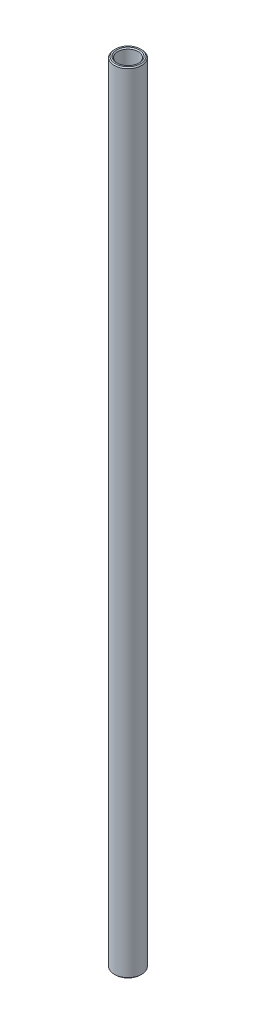
ISO-10303-21;
HEADER;
FILE_DESCRIPTION(('STEP AP214'),'2;1');
FILE_NAME('part.step','',(''),(''),'','','');
FILE_SCHEMA(('AUTOMOTIVE_DESIGN { 1 0 10303 214 1 1 1 1 }'));
ENDSEC;
DATA;
#1=APPLICATION_CONTEXT('core data for automotive mechanical design processes');
#2=APPLICATION_PROTOCOL_DEFINITION('international standard','automotive_design',2000,#1);
#3=PRODUCT_CONTEXT('',#1,'mechanical');
#4=PRODUCT('Part','Part','',(#3));
#5=PRODUCT_RELATED_PRODUCT_CATEGORY('part','',(#4));
#6=PRODUCT_DEFINITION_FORMATION('','',#4);
#7=PRODUCT_DEFINITION_CONTEXT('part definition',#1,'design');
#8=PRODUCT_DEFINITION('design','',#6,#7);
#9=PRODUCT_DEFINITION_SHAPE('','',#8);
#10=(LENGTH_UNIT() NAMED_UNIT(*) SI_UNIT(.MILLI.,.METRE.));
#11=(NAMED_UNIT(*) PLANE_ANGLE_UNIT() SI_UNIT($,.RADIAN.));
#12=(NAMED_UNIT(*) SI_UNIT($,.STERADIAN.) SOLID_ANGLE_UNIT());
#13=UNCERTAINTY_MEASURE_WITH_UNIT(LENGTH_MEASURE(1.E-05),#10,'distance_accuracy_value','');
#14=(GEOMETRIC_REPRESENTATION_CONTEXT(3) GLOBAL_UNCERTAINTY_ASSIGNED_CONTEXT((#13)) GLOBAL_UNIT_ASSIGNED_CONTEXT((#10,
#11,#12)) REPRESENTATION_CONTEXT('',''));
#15=CARTESIAN_POINT('',(0.,0.,0.));
#16=DIRECTION('',(0.,0.,1.));
#17=DIRECTION('',(1.,0.,0.));
#18=AXIS2_PLACEMENT_3D('',#15,#16,#17);
#19=CARTESIAN_POINT('',(0.,230.,0.));
#20=DIRECTION('',(0.,1.,0.));
#21=DIRECTION('',(0.,0.,1.));
#22=AXIS2_PLACEMENT_3D('',#19,#20,#21);
#23=PLANE('',#22);
#24=CARTESIAN_POINT('',(0.,230.,0.));
#25=DIRECTION('',(0.,1.,0.));
#26=DIRECTION('',(0.,0.,1.));
#27=AXIS2_PLACEMENT_3D('',#24,#25,#26);
#28=CIRCLE('',#27,3.29999999999997);
#29=CARTESIAN_POINT('',(0.,230.,3.29999999999997));
#30=VERTEX_POINT('',#29);
#31=EDGE_CURVE('E59',#30,#30,#28,.F.);
#32=ORIENTED_EDGE('',*,*,#31,.T.);
#33=EDGE_LOOP('',(#32));
#34=FACE_BOUND('',#33,.T.);
#35=CARTESIAN_POINT('',(0.,230.,0.));
#36=DIRECTION('',(0.,1.,0.));
#37=DIRECTION('',(0.,0.,1.));
#38=AXIS2_PLACEMENT_3D('',#35,#36,#37);
#39=CIRCLE('',#38,3.70000000000001);
#40=CARTESIAN_POINT('',(0.,230.,3.70000000000001));
#41=VERTEX_POINT('',#40);
#42=EDGE_CURVE('E62',#41,#41,#39,.T.);
#43=ORIENTED_EDGE('',*,*,#42,.T.);
#44=EDGE_LOOP('',(#43));
#45=FACE_BOUND('',#44,.T.);
#46=ADVANCED_FACE('F38',(#34,#45),#23,.T.);
#47=CARTESIAN_POINT('',(0.,0.,0.));
#48=DIRECTION('',(0.,1.,0.));
#49=DIRECTION('',(0.,0.,1.));
#50=AXIS2_PLACEMENT_3D('',#47,#48,#49);
#51=PLANE('',#50);
#52=CARTESIAN_POINT('',(0.,0.,0.));
#53=DIRECTION('',(0.,1.,0.));
#54=DIRECTION('',(0.,0.,1.));
#55=AXIS2_PLACEMENT_3D('',#52,#53,#54);
#56=CIRCLE('',#55,3.30000000000003);
#57=CARTESIAN_POINT('',(0.,0.,3.30000000000003));
#58=VERTEX_POINT('',#57);
#59=EDGE_CURVE('E50',#58,#58,#56,.T.);
#60=ORIENTED_EDGE('',*,*,#59,.T.);
#61=EDGE_LOOP('',(#60));
#62=FACE_BOUND('',#61,.T.);
#63=CARTESIAN_POINT('',(0.,0.,0.));
#64=DIRECTION('',(0.,1.,0.));
#65=DIRECTION('',(0.,0.,1.));
#66=AXIS2_PLACEMENT_3D('',#63,#64,#65);
#67=CIRCLE('',#66,3.70000000000001);
#68=CARTESIAN_POINT('',(0.,0.,3.70000000000001));
#69=VERTEX_POINT('',#68);
#70=EDGE_CURVE('E54',#69,#69,#67,.F.);
#71=ORIENTED_EDGE('',*,*,#70,.T.);
#72=EDGE_LOOP('',(#71));
#73=FACE_BOUND('',#72,.T.);
#74=ADVANCED_FACE('F82',(#62,#73),#51,.F.);
#75=CARTESIAN_POINT('',(0.,230.,0.));
#76=DIRECTION('',(0.,-1.,0.));
#77=DIRECTION('',(0.,0.,-1.));
#78=AXIS2_PLACEMENT_3D('',#75,#76,#77);
#79=CYLINDRICAL_SURFACE('',#78,4.);
#80=CARTESIAN_POINT('',(0.,0.299999999999967,0.));
#81=DIRECTION('',(0.,1.,0.));
#82=DIRECTION('',(0.,0.,1.));
#83=AXIS2_PLACEMENT_3D('',#80,#81,#82);
#84=CIRCLE('',#83,4.);
#85=CARTESIAN_POINT('',(0.,0.299999999999967,4.));
#86=VERTEX_POINT('',#85);
#87=EDGE_CURVE('E10',#86,#86,#84,.T.);
#88=ORIENTED_EDGE('',*,*,#87,.T.);
#89=EDGE_LOOP('',(#88));
#90=FACE_BOUND('',#89,.T.);
#91=CARTESIAN_POINT('',(0.,229.7,0.));
#92=DIRECTION('',(0.,1.,0.));
#93=DIRECTION('',(0.,0.,1.));
#94=AXIS2_PLACEMENT_3D('',#91,#92,#93);
#95=CIRCLE('',#94,4.);
#96=CARTESIAN_POINT('',(0.,229.7,4.));
#97=VERTEX_POINT('',#96);
#98=EDGE_CURVE('E46',#97,#97,#95,.F.);
#99=ORIENTED_EDGE('',*,*,#98,.T.);
#100=EDGE_LOOP('',(#99));
#101=FACE_BOUND('',#100,.T.);
#102=ADVANCED_FACE('F85',(#90,#101),#79,.T.);
#103=CARTESIAN_POINT('',(0.,230.,0.));
#104=DIRECTION('',(0.,-1.,0.));
#105=DIRECTION('',(0.,0.,-1.));
#106=AXIS2_PLACEMENT_3D('',#103,#104,#105);
#107=CYLINDRICAL_SURFACE('',#106,3.);
#108=CARTESIAN_POINT('',(0.,229.7,0.));
#109=DIRECTION('',(0.,1.,0.));
#110=DIRECTION('',(0.,0.,1.));
#111=AXIS2_PLACEMENT_3D('',#108,#109,#110);
#112=CIRCLE('',#111,3.);
#113=CARTESIAN_POINT('',(0.,229.7,3.));
#114=VERTEX_POINT('',#113);
#115=EDGE_CURVE('E65',#114,#114,#112,.T.);
#116=ORIENTED_EDGE('',*,*,#115,.T.);
#117=EDGE_LOOP('',(#116));
#118=FACE_BOUND('',#117,.T.);
#119=CARTESIAN_POINT('',(0.,0.300000000000022,0.));
#120=DIRECTION('',(0.,1.,0.));
#121=DIRECTION('',(0.,0.,1.));
#122=AXIS2_PLACEMENT_3D('',#119,#120,#121);
#123=CIRCLE('',#122,3.);
#124=CARTESIAN_POINT('',(0.,0.300000000000022,3.));
#125=VERTEX_POINT('',#124);
#126=EDGE_CURVE('E68',#125,#125,#123,.F.);
#127=ORIENTED_EDGE('',*,*,#126,.T.);
#128=EDGE_LOOP('',(#127));
#129=FACE_BOUND('',#128,.T.);
#130=ADVANCED_FACE('F72',(#118,#129),#107,.F.);
#131=CARTESIAN_POINT('',(0.,229.7,0.));
#132=DIRECTION('',(0.,1.,0.));
#133=DIRECTION('',(0.,0.,1.));
#134=AXIS2_PLACEMENT_3D('',#131,#132,#133);
#135=CONICAL_SURFACE('',#134,3.,0.785398163397452);
#136=ORIENTED_EDGE('',*,*,#31,.F.);
#137=EDGE_LOOP('',(#136));
#138=FACE_BOUND('',#137,.T.);
#139=ORIENTED_EDGE('',*,*,#115,.F.);
#140=EDGE_LOOP('',(#139));
#141=FACE_BOUND('',#140,.T.);
#142=ADVANCED_FACE('F78',(#138,#141),#135,.F.);
#143=CARTESIAN_POINT('',(0.,0.,0.));
#144=DIRECTION('',(0.,-1.,0.));
#145=DIRECTION('',(0.,0.,-1.));
#146=AXIS2_PLACEMENT_3D('',#143,#144,#145);
#147=CONICAL_SURFACE('',#146,3.30000000000003,0.785398163397452);
#148=ORIENTED_EDGE('',*,*,#126,.F.);
#149=EDGE_LOOP('',(#148));
#150=FACE_BOUND('',#149,.T.);
#151=ORIENTED_EDGE('',*,*,#59,.F.);
#152=EDGE_LOOP('',(#151));
#153=FACE_BOUND('',#152,.T.);
#154=ADVANCED_FACE('F74',(#150,#153),#147,.F.);
#155=CARTESIAN_POINT('',(0.,0.299999999999967,0.));
#156=DIRECTION('',(0.,1.,0.));
#157=DIRECTION('',(0.,0.,1.));
#158=AXIS2_PLACEMENT_3D('',#155,#156,#157);
#159=CONICAL_SURFACE('',#158,4.,0.785398163397489);
#160=ORIENTED_EDGE('',*,*,#70,.F.);
#161=EDGE_LOOP('',(#160));
#162=FACE_BOUND('',#161,.T.);
#163=ORIENTED_EDGE('',*,*,#87,.F.);
#164=EDGE_LOOP('',(#163));
#165=FACE_BOUND('',#164,.T.);
#166=ADVANCED_FACE('F77',(#162,#165),#159,.T.);
#167=CARTESIAN_POINT('',(0.,230.,0.));
#168=DIRECTION('',(0.,-1.,0.));
#169=DIRECTION('',(0.,0.,-1.));
#170=AXIS2_PLACEMENT_3D('',#167,#168,#169);
#171=CONICAL_SURFACE('',#170,3.70000000000001,0.785398163397443);
#172=ORIENTED_EDGE('',*,*,#98,.F.);
#173=EDGE_LOOP('',(#172));
#174=FACE_BOUND('',#173,.T.);
#175=ORIENTED_EDGE('',*,*,#42,.F.);
#176=EDGE_LOOP('',(#175));
#177=FACE_BOUND('',#176,.T.);
#178=ADVANCED_FACE('F41',(#174,#177),#171,.T.);
#179=CLOSED_SHELL('',(#46,#74,#102,#130,#142,#154,#166,#178));
#180=MANIFOLD_SOLID_BREP('B2',#179);
#181=ADVANCED_BREP_SHAPE_REPRESENTATION('',(#18,#180),#14);
#182=SHAPE_DEFINITION_REPRESENTATION(#9,#181);
ENDSEC;
END-ISO-10303-21;
